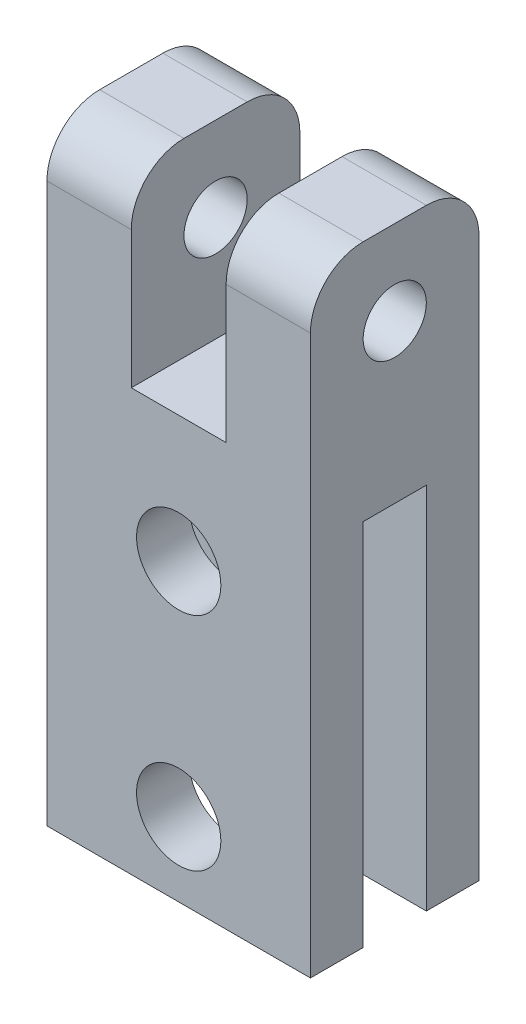
ISO-10303-21;
HEADER;
FILE_DESCRIPTION(('STEP AP214'),'2;1');
FILE_NAME('part.step','',(''),(''),'','','');
FILE_SCHEMA(('AUTOMOTIVE_DESIGN { 1 0 10303 214 1 1 1 1 }'));
ENDSEC;
DATA;
#1=APPLICATION_CONTEXT('core data for automotive mechanical design processes');
#2=APPLICATION_PROTOCOL_DEFINITION('international standard','automotive_design',2000,#1);
#3=PRODUCT_CONTEXT('',#1,'mechanical');
#4=PRODUCT('Part','Part','',(#3));
#5=PRODUCT_RELATED_PRODUCT_CATEGORY('part','',(#4));
#6=PRODUCT_DEFINITION_FORMATION('','',#4);
#7=PRODUCT_DEFINITION_CONTEXT('part definition',#1,'design');
#8=PRODUCT_DEFINITION('design','',#6,#7);
#9=PRODUCT_DEFINITION_SHAPE('','',#8);
#10=(LENGTH_UNIT() NAMED_UNIT(*) SI_UNIT(.MILLI.,.METRE.));
#11=(NAMED_UNIT(*) PLANE_ANGLE_UNIT() SI_UNIT($,.RADIAN.));
#12=(NAMED_UNIT(*) SI_UNIT($,.STERADIAN.) SOLID_ANGLE_UNIT());
#13=UNCERTAINTY_MEASURE_WITH_UNIT(LENGTH_MEASURE(1.E-05),#10,'distance_accuracy_value','');
#14=(GEOMETRIC_REPRESENTATION_CONTEXT(3) GLOBAL_UNCERTAINTY_ASSIGNED_CONTEXT((#13)) GLOBAL_UNIT_ASSIGNED_CONTEXT((#10,
#11,#12)) REPRESENTATION_CONTEXT('',''));
#15=CARTESIAN_POINT('',(0.,0.,0.));
#16=DIRECTION('',(0.,0.,1.));
#17=DIRECTION('',(1.,0.,0.));
#18=AXIS2_PLACEMENT_3D('',#15,#16,#17);
#19=CARTESIAN_POINT('',(0.,0.,16.));
#20=DIRECTION('',(0.,0.,1.));
#21=DIRECTION('',(1.,0.,0.));
#22=AXIS2_PLACEMENT_3D('',#19,#20,#21);
#23=PLANE('',#22);
#24=CARTESIAN_POINT('',(0.,21.,16.));
#25=DIRECTION('',(0.,0.,1.));
#26=DIRECTION('',(1.,0.,0.));
#27=AXIS2_PLACEMENT_3D('',#24,#25,#26);
#28=CIRCLE('',#27,4.00000000000001);
#29=CARTESIAN_POINT('',(4.00000000000001,21.,16.));
#30=VERTEX_POINT('',#29);
#31=EDGE_CURVE('E211',#30,#30,#28,.T.);
#32=ORIENTED_EDGE('',*,*,#31,.F.);
#33=EDGE_LOOP('',(#32));
#34=FACE_BOUND('',#33,.T.);
#35=CARTESIAN_POINT('',(0.,0.,16.));
#36=DIRECTION('',(0.,0.,1.));
#37=DIRECTION('',(1.,0.,0.));
#38=AXIS2_PLACEMENT_3D('',#35,#36,#37);
#39=CIRCLE('',#38,4.00000000000001);
#40=CARTESIAN_POINT('',(4.00000000000001,0.,16.));
#41=VERTEX_POINT('',#40);
#42=EDGE_CURVE('E203',#41,#41,#39,.T.);
#43=ORIENTED_EDGE('',*,*,#42,.F.);
#44=EDGE_LOOP('',(#43));
#45=FACE_BOUND('',#44,.T.);
#46=DIRECTION('',(0.,1.,0.));
#47=VECTOR('',#46,1.);
#48=CARTESIAN_POINT('',(-4.5,33.,16.));
#49=LINE('',#48,#47);
#50=CARTESIAN_POINT('',(-4.5,33.,16.));
#51=VERTEX_POINT('',#50);
#52=CARTESIAN_POINT('',(-4.5,46.,16.));
#53=VERTEX_POINT('',#52);
#54=EDGE_CURVE('E233',#51,#53,#49,.T.);
#55=ORIENTED_EDGE('',*,*,#54,.T.);
#56=DIRECTION('',(-1.,0.,0.));
#57=VECTOR('',#56,1.);
#58=CARTESIAN_POINT('',(0.,46.,16.));
#59=LINE('',#58,#57);
#60=CARTESIAN_POINT('',(-12.5,46.,16.));
#61=VERTEX_POINT('',#60);
#62=EDGE_CURVE('E11',#53,#61,#59,.T.);
#63=ORIENTED_EDGE('',*,*,#62,.T.);
#64=DIRECTION('',(0.,-1.,0.));
#65=VECTOR('',#64,1.);
#66=CARTESIAN_POINT('',(-12.5,28.,16.));
#67=LINE('',#66,#65);
#68=CARTESIAN_POINT('',(-12.5,-7.00000000000001,16.));
#69=VERTEX_POINT('',#68);
#70=EDGE_CURVE('E237',#61,#69,#67,.T.);
#71=ORIENTED_EDGE('',*,*,#70,.T.);
#72=DIRECTION('',(1.,0.,0.));
#73=VECTOR('',#72,1.);
#74=CARTESIAN_POINT('',(-12.5,-7.00000000000001,16.));
#75=LINE('',#74,#73);
#76=CARTESIAN_POINT('',(12.5,-7.00000000000001,16.));
#77=VERTEX_POINT('',#76);
#78=EDGE_CURVE('E219',#69,#77,#75,.T.);
#79=ORIENTED_EDGE('',*,*,#78,.T.);
#80=DIRECTION('',(0.,1.,0.));
#81=VECTOR('',#80,1.);
#82=CARTESIAN_POINT('',(12.5,-7.00000000000001,16.));
#83=LINE('',#82,#81);
#84=CARTESIAN_POINT('',(12.5,46.,16.));
#85=VERTEX_POINT('',#84);
#86=EDGE_CURVE('E223',#77,#85,#83,.T.);
#87=ORIENTED_EDGE('',*,*,#86,.T.);
#88=DIRECTION('',(-1.,0.,0.));
#89=VECTOR('',#88,1.);
#90=CARTESIAN_POINT('',(0.,46.,16.));
#91=LINE('',#90,#89);
#92=CARTESIAN_POINT('',(4.5,46.,16.));
#93=VERTEX_POINT('',#92);
#94=EDGE_CURVE('E48',#85,#93,#91,.T.);
#95=ORIENTED_EDGE('',*,*,#94,.T.);
#96=DIRECTION('',(0.,-1.,0.));
#97=VECTOR('',#96,1.);
#98=CARTESIAN_POINT('',(4.5,33.,16.));
#99=LINE('',#98,#97);
#100=CARTESIAN_POINT('',(4.5,33.,16.));
#101=VERTEX_POINT('',#100);
#102=EDGE_CURVE('E227',#93,#101,#99,.T.);
#103=ORIENTED_EDGE('',*,*,#102,.T.);
#104=DIRECTION('',(-1.,0.,0.));
#105=VECTOR('',#104,1.);
#106=CARTESIAN_POINT('',(-4.5,33.,16.));
#107=LINE('',#106,#105);
#108=EDGE_CURVE('E230',#101,#51,#107,.T.);
#109=ORIENTED_EDGE('',*,*,#108,.T.);
#110=EDGE_LOOP('',(#55,#63,#71,#79,#87,#95,#103,#109));
#111=FACE_BOUND('',#110,.T.);
#112=ADVANCED_FACE('F39',(#34,#45,#111),#23,.T.);
#113=CARTESIAN_POINT('',(0.,0.,0.));
#114=DIRECTION('',(0.,0.,1.));
#115=DIRECTION('',(1.,0.,0.));
#116=AXIS2_PLACEMENT_3D('',#113,#114,#115);
#117=PLANE('',#116);
#118=CARTESIAN_POINT('',(0.,21.,0.));
#119=DIRECTION('',(0.,0.,1.));
#120=DIRECTION('',(1.,0.,0.));
#121=AXIS2_PLACEMENT_3D('',#118,#119,#120);
#122=CIRCLE('',#121,4.00000000000001);
#123=CARTESIAN_POINT('',(4.00000000000001,21.,0.));
#124=VERTEX_POINT('',#123);
#125=EDGE_CURVE('E207',#124,#124,#122,.T.);
#126=ORIENTED_EDGE('',*,*,#125,.T.);
#127=EDGE_LOOP('',(#126));
#128=FACE_BOUND('',#127,.T.);
#129=CARTESIAN_POINT('',(0.,0.,0.));
#130=DIRECTION('',(0.,0.,1.));
#131=DIRECTION('',(1.,0.,0.));
#132=AXIS2_PLACEMENT_3D('',#129,#130,#131);
#133=CIRCLE('',#132,4.00000000000001);
#134=CARTESIAN_POINT('',(4.00000000000001,0.,0.));
#135=VERTEX_POINT('',#134);
#136=EDGE_CURVE('E202',#135,#135,#133,.T.);
#137=ORIENTED_EDGE('',*,*,#136,.T.);
#138=EDGE_LOOP('',(#137));
#139=FACE_BOUND('',#138,.T.);
#140=DIRECTION('',(0.,-1.,0.));
#141=VECTOR('',#140,1.);
#142=CARTESIAN_POINT('',(-12.5,28.,0.));
#143=LINE('',#142,#141);
#144=CARTESIAN_POINT('',(-12.5,46.,0.));
#145=VERTEX_POINT('',#144);
#146=CARTESIAN_POINT('',(-12.5,-7.00000000000001,0.));
#147=VERTEX_POINT('',#146);
#148=EDGE_CURVE('E224',#145,#147,#143,.T.);
#149=ORIENTED_EDGE('',*,*,#148,.F.);
#150=DIRECTION('',(-1.,0.,0.));
#151=VECTOR('',#150,1.);
#152=CARTESIAN_POINT('',(-4.5,46.,0.));
#153=LINE('',#152,#151);
#154=CARTESIAN_POINT('',(-4.5,46.,0.));
#155=VERTEX_POINT('',#154);
#156=EDGE_CURVE('E309',#145,#155,#153,.F.);
#157=ORIENTED_EDGE('',*,*,#156,.T.);
#158=DIRECTION('',(0.,1.,0.));
#159=VECTOR('',#158,1.);
#160=CARTESIAN_POINT('',(-4.5,33.,0.));
#161=LINE('',#160,#159);
#162=CARTESIAN_POINT('',(-4.5,33.,0.));
#163=VERTEX_POINT('',#162);
#164=EDGE_CURVE('E253',#163,#155,#161,.T.);
#165=ORIENTED_EDGE('',*,*,#164,.F.);
#166=DIRECTION('',(-1.,0.,0.));
#167=VECTOR('',#166,1.);
#168=CARTESIAN_POINT('',(-4.5,33.,0.));
#169=LINE('',#168,#167);
#170=CARTESIAN_POINT('',(4.5,33.,0.));
#171=VERTEX_POINT('',#170);
#172=EDGE_CURVE('E250',#171,#163,#169,.T.);
#173=ORIENTED_EDGE('',*,*,#172,.F.);
#174=DIRECTION('',(0.,-1.,0.));
#175=VECTOR('',#174,1.);
#176=CARTESIAN_POINT('',(4.5,33.,0.));
#177=LINE('',#176,#175);
#178=CARTESIAN_POINT('',(4.5,46.,0.));
#179=VERTEX_POINT('',#178);
#180=EDGE_CURVE('E247',#179,#171,#177,.T.);
#181=ORIENTED_EDGE('',*,*,#180,.F.);
#182=DIRECTION('',(-1.,0.,0.));
#183=VECTOR('',#182,1.);
#184=CARTESIAN_POINT('',(12.5,46.,0.));
#185=LINE('',#184,#183);
#186=CARTESIAN_POINT('',(12.5,46.,0.));
#187=VERTEX_POINT('',#186);
#188=EDGE_CURVE('E306',#179,#187,#185,.F.);
#189=ORIENTED_EDGE('',*,*,#188,.T.);
#190=DIRECTION('',(0.,1.,0.));
#191=VECTOR('',#190,1.);
#192=CARTESIAN_POINT('',(12.5,53.,0.));
#193=LINE('',#192,#191);
#194=CARTESIAN_POINT('',(12.5,-7.00000000000001,0.));
#195=VERTEX_POINT('',#194);
#196=EDGE_CURVE('E243',#195,#187,#193,.T.);
#197=ORIENTED_EDGE('',*,*,#196,.F.);
#198=DIRECTION('',(1.,0.,0.));
#199=VECTOR('',#198,1.);
#200=CARTESIAN_POINT('',(-12.5,-7.00000000000001,0.));
#201=LINE('',#200,#199);
#202=EDGE_CURVE('E215',#147,#195,#201,.T.);
#203=ORIENTED_EDGE('',*,*,#202,.F.);
#204=EDGE_LOOP('',(#149,#157,#165,#173,#181,#189,#197,#203));
#205=FACE_BOUND('',#204,.T.);
#206=ADVANCED_FACE('F370',(#128,#139,#205),#117,.F.);
#207=CARTESIAN_POINT('',(12.5,53.,16.));
#208=DIRECTION('',(-1.,0.,0.));
#209=DIRECTION('',(0.,0.,1.));
#210=AXIS2_PLACEMENT_3D('',#207,#208,#209);
#211=PLANE('',#210);
#212=CARTESIAN_POINT('',(12.5,43.,8.));
#213=DIRECTION('',(-1.,0.,0.));
#214=DIRECTION('',(0.,0.,1.));
#215=AXIS2_PLACEMENT_3D('',#212,#213,#214);
#216=CIRCLE('',#215,3.);
#217=CARTESIAN_POINT('',(12.5,43.,11.));
#218=VERTEX_POINT('',#217);
#219=EDGE_CURVE('E388',#218,#218,#216,.F.);
#220=ORIENTED_EDGE('',*,*,#219,.F.);
#221=EDGE_LOOP('',(#220));
#222=FACE_BOUND('',#221,.T.);
#223=ORIENTED_EDGE('',*,*,#196,.T.);
#224=CARTESIAN_POINT('',(12.5,46.,5.));
#225=DIRECTION('',(-1.,0.,0.));
#226=DIRECTION('',(0.,0.,1.));
#227=AXIS2_PLACEMENT_3D('',#224,#225,#226);
#228=CIRCLE('',#227,5.);
#229=CARTESIAN_POINT('',(12.5,51.,5.));
#230=VERTEX_POINT('',#229);
#231=EDGE_CURVE('E332',#187,#230,#228,.F.);
#232=ORIENTED_EDGE('',*,*,#231,.T.);
#233=DIRECTION('',(0.,0.,-1.));
#234=VECTOR('',#233,1.);
#235=CARTESIAN_POINT('',(12.5,51.,16.));
#236=LINE('',#235,#234);
#237=CARTESIAN_POINT('',(12.5,51.,11.));
#238=VERTEX_POINT('',#237);
#239=EDGE_CURVE('E289',#238,#230,#236,.T.);
#240=ORIENTED_EDGE('',*,*,#239,.F.);
#241=CARTESIAN_POINT('',(12.5,46.,11.));
#242=DIRECTION('',(-1.,0.,0.));
#243=DIRECTION('',(0.,0.,1.));
#244=AXIS2_PLACEMENT_3D('',#241,#242,#243);
#245=CIRCLE('',#244,5.);
#246=EDGE_CURVE('E55',#238,#85,#245,.F.);
#247=ORIENTED_EDGE('',*,*,#246,.T.);
#248=ORIENTED_EDGE('',*,*,#86,.F.);
#249=DIRECTION('',(0.,0.,-1.));
#250=VECTOR('',#249,1.);
#251=CARTESIAN_POINT('',(12.5,-7.00000000000001,16.));
#252=LINE('',#251,#250);
#253=CARTESIAN_POINT('',(12.5,-7.00000000000001,11.));
#254=VERTEX_POINT('',#253);
#255=EDGE_CURVE('E272',#77,#254,#252,.T.);
#256=ORIENTED_EDGE('',*,*,#255,.T.);
#257=DIRECTION('',(0.,-1.,0.));
#258=VECTOR('',#257,1.);
#259=CARTESIAN_POINT('',(12.5,28.,11.));
#260=LINE('',#259,#258);
#261=CARTESIAN_POINT('',(12.5,28.,11.));
#262=VERTEX_POINT('',#261);
#263=EDGE_CURVE('E187',#262,#254,#260,.T.);
#264=ORIENTED_EDGE('',*,*,#263,.F.);
#265=DIRECTION('',(0.,0.,1.));
#266=VECTOR('',#265,1.);
#267=CARTESIAN_POINT('',(12.5,28.,11.));
#268=LINE('',#267,#266);
#269=CARTESIAN_POINT('',(12.5,28.,5.));
#270=VERTEX_POINT('',#269);
#271=EDGE_CURVE('E165',#270,#262,#268,.T.);
#272=ORIENTED_EDGE('',*,*,#271,.F.);
#273=DIRECTION('',(0.,-1.,0.));
#274=VECTOR('',#273,1.);
#275=CARTESIAN_POINT('',(12.5,28.,5.));
#276=LINE('',#275,#274);
#277=CARTESIAN_POINT('',(12.5,-7.00000000000001,5.));
#278=VERTEX_POINT('',#277);
#279=EDGE_CURVE('E161',#270,#278,#276,.T.);
#280=ORIENTED_EDGE('',*,*,#279,.T.);
#281=EDGE_CURVE('E271',#278,#195,#252,.T.);
#282=ORIENTED_EDGE('',*,*,#281,.T.);
#283=EDGE_LOOP('',(#223,#232,#240,#247,#248,#256,#264,#272,#280,#282));
#284=FACE_BOUND('',#283,.T.);
#285=ADVANCED_FACE('F423',(#222,#284),#211,.F.);
#286=CARTESIAN_POINT('',(4.5,33.,16.));
#287=DIRECTION('',(1.,0.,0.));
#288=DIRECTION('',(0.,0.,-1.));
#289=AXIS2_PLACEMENT_3D('',#286,#287,#288);
#290=PLANE('',#289);
#291=CARTESIAN_POINT('',(4.5,43.,8.));
#292=DIRECTION('',(1.,0.,0.));
#293=DIRECTION('',(0.,0.,-1.));
#294=AXIS2_PLACEMENT_3D('',#291,#292,#293);
#295=CIRCLE('',#294,3.);
#296=CARTESIAN_POINT('',(4.5,43.,5.));
#297=VERTEX_POINT('',#296);
#298=EDGE_CURVE('E395',#297,#297,#295,.F.);
#299=ORIENTED_EDGE('',*,*,#298,.F.);
#300=EDGE_LOOP('',(#299));
#301=FACE_BOUND('',#300,.T.);
#302=DIRECTION('',(0.,0.,1.));
#303=VECTOR('',#302,1.);
#304=CARTESIAN_POINT('',(4.5,51.,16.));
#305=LINE('',#304,#303);
#306=CARTESIAN_POINT('',(4.5,51.,5.));
#307=VERTEX_POINT('',#306);
#308=CARTESIAN_POINT('',(4.5,51.,11.));
#309=VERTEX_POINT('',#308);
#310=EDGE_CURVE('E405',#307,#309,#305,.T.);
#311=ORIENTED_EDGE('',*,*,#310,.F.);
#312=CARTESIAN_POINT('',(4.5,46.,5.));
#313=DIRECTION('',(1.,0.,0.));
#314=DIRECTION('',(0.,0.,-1.));
#315=AXIS2_PLACEMENT_3D('',#312,#313,#314);
#316=CIRCLE('',#315,5.);
#317=EDGE_CURVE('E327',#307,#179,#316,.F.);
#318=ORIENTED_EDGE('',*,*,#317,.T.);
#319=ORIENTED_EDGE('',*,*,#180,.T.);
#320=DIRECTION('',(0.,0.,-1.));
#321=VECTOR('',#320,1.);
#322=CARTESIAN_POINT('',(4.5,33.,16.));
#323=LINE('',#322,#321);
#324=EDGE_CURVE('E267',#101,#171,#323,.T.);
#325=ORIENTED_EDGE('',*,*,#324,.F.);
#326=ORIENTED_EDGE('',*,*,#102,.F.);
#327=CARTESIAN_POINT('',(4.5,46.,11.));
#328=DIRECTION('',(1.,0.,0.));
#329=DIRECTION('',(0.,0.,-1.));
#330=AXIS2_PLACEMENT_3D('',#327,#328,#329);
#331=CIRCLE('',#330,5.);
#332=EDGE_CURVE('E63',#93,#309,#331,.F.);
#333=ORIENTED_EDGE('',*,*,#332,.T.);
#334=EDGE_LOOP('',(#311,#318,#319,#325,#326,#333));
#335=FACE_BOUND('',#334,.T.);
#336=ADVANCED_FACE('F340',(#301,#335),#290,.F.);
#337=CARTESIAN_POINT('',(-4.5,33.,16.));
#338=DIRECTION('',(-1.,0.,0.));
#339=DIRECTION('',(0.,0.,1.));
#340=AXIS2_PLACEMENT_3D('',#337,#338,#339);
#341=PLANE('',#340);
#342=CARTESIAN_POINT('',(-4.5,43.,8.));
#343=DIRECTION('',(-1.,0.,0.));
#344=DIRECTION('',(0.,0.,1.));
#345=AXIS2_PLACEMENT_3D('',#342,#343,#344);
#346=CIRCLE('',#345,3.);
#347=CARTESIAN_POINT('',(-4.5,43.,11.));
#348=VERTEX_POINT('',#347);
#349=EDGE_CURVE('E288',#348,#348,#346,.F.);
#350=ORIENTED_EDGE('',*,*,#349,.F.);
#351=EDGE_LOOP('',(#350));
#352=FACE_BOUND('',#351,.T.);
#353=ORIENTED_EDGE('',*,*,#164,.T.);
#354=CARTESIAN_POINT('',(-4.5,46.,5.));
#355=DIRECTION('',(-1.,0.,0.));
#356=DIRECTION('',(0.,0.,1.));
#357=AXIS2_PLACEMENT_3D('',#354,#355,#356);
#358=CIRCLE('',#357,5.);
#359=CARTESIAN_POINT('',(-4.5,51.,5.));
#360=VERTEX_POINT('',#359);
#361=EDGE_CURVE('E315',#155,#360,#358,.F.);
#362=ORIENTED_EDGE('',*,*,#361,.T.);
#363=DIRECTION('',(0.,0.,-1.));
#364=VECTOR('',#363,1.);
#365=CARTESIAN_POINT('',(-4.5,51.,16.));
#366=LINE('',#365,#364);
#367=CARTESIAN_POINT('',(-4.5,51.,11.));
#368=VERTEX_POINT('',#367);
#369=EDGE_CURVE('E362',#368,#360,#366,.T.);
#370=ORIENTED_EDGE('',*,*,#369,.F.);
#371=CARTESIAN_POINT('',(-4.5,46.,11.));
#372=DIRECTION('',(-1.,0.,0.));
#373=DIRECTION('',(0.,0.,1.));
#374=AXIS2_PLACEMENT_3D('',#371,#372,#373);
#375=CIRCLE('',#374,5.);
#376=EDGE_CURVE('E312',#368,#53,#375,.F.);
#377=ORIENTED_EDGE('',*,*,#376,.T.);
#378=ORIENTED_EDGE('',*,*,#54,.F.);
#379=DIRECTION('',(0.,0.,-1.));
#380=VECTOR('',#379,1.);
#381=CARTESIAN_POINT('',(-4.5,33.,16.));
#382=LINE('',#381,#380);
#383=EDGE_CURVE('E263',#51,#163,#382,.T.);
#384=ORIENTED_EDGE('',*,*,#383,.T.);
#385=EDGE_LOOP('',(#353,#362,#370,#377,#378,#384));
#386=FACE_BOUND('',#385,.T.);
#387=ADVANCED_FACE('F435',(#352,#386),#341,.F.);
#388=CARTESIAN_POINT('',(-12.5,28.,16.));
#389=DIRECTION('',(1.,0.,0.));
#390=DIRECTION('',(0.,0.,-1.));
#391=AXIS2_PLACEMENT_3D('',#388,#389,#390);
#392=PLANE('',#391);
#393=CARTESIAN_POINT('',(-12.5,43.,8.));
#394=DIRECTION('',(1.,0.,0.));
#395=DIRECTION('',(0.,0.,-1.));
#396=AXIS2_PLACEMENT_3D('',#393,#394,#395);
#397=CIRCLE('',#396,3.);
#398=CARTESIAN_POINT('',(-12.5,43.,5.));
#399=VERTEX_POINT('',#398);
#400=EDGE_CURVE('E284',#399,#399,#397,.F.);
#401=ORIENTED_EDGE('',*,*,#400,.F.);
#402=EDGE_LOOP('',(#401));
#403=FACE_BOUND('',#402,.T.);
#404=DIRECTION('',(0.,0.,1.));
#405=VECTOR('',#404,1.);
#406=CARTESIAN_POINT('',(-12.5,51.,16.));
#407=LINE('',#406,#405);
#408=CARTESIAN_POINT('',(-12.5,51.,5.));
#409=VERTEX_POINT('',#408);
#410=CARTESIAN_POINT('',(-12.5,51.,11.));
#411=VERTEX_POINT('',#410);
#412=EDGE_CURVE('E276',#409,#411,#407,.T.);
#413=ORIENTED_EDGE('',*,*,#412,.F.);
#414=CARTESIAN_POINT('',(-12.5,46.,5.));
#415=DIRECTION('',(1.,0.,0.));
#416=DIRECTION('',(0.,0.,-1.));
#417=AXIS2_PLACEMENT_3D('',#414,#415,#416);
#418=CIRCLE('',#417,5.);
#419=EDGE_CURVE('E303',#409,#145,#418,.F.);
#420=ORIENTED_EDGE('',*,*,#419,.T.);
#421=ORIENTED_EDGE('',*,*,#148,.T.);
#422=DIRECTION('',(0.,0.,-1.));
#423=VECTOR('',#422,1.);
#424=CARTESIAN_POINT('',(-12.5,-7.00000000000001,16.));
#425=LINE('',#424,#423);
#426=CARTESIAN_POINT('',(-12.5,-7.00000000000001,5.));
#427=VERTEX_POINT('',#426);
#428=EDGE_CURVE('E182',#427,#147,#425,.T.);
#429=ORIENTED_EDGE('',*,*,#428,.F.);
#430=DIRECTION('',(0.,-1.,0.));
#431=VECTOR('',#430,1.);
#432=CARTESIAN_POINT('',(-12.5,28.,5.));
#433=LINE('',#432,#431);
#434=CARTESIAN_POINT('',(-12.5,28.,5.));
#435=VERTEX_POINT('',#434);
#436=EDGE_CURVE('E158',#435,#427,#433,.T.);
#437=ORIENTED_EDGE('',*,*,#436,.F.);
#438=DIRECTION('',(0.,0.,-1.));
#439=VECTOR('',#438,1.);
#440=CARTESIAN_POINT('',(-12.5,28.,11.));
#441=LINE('',#440,#439);
#442=CARTESIAN_POINT('',(-12.5,28.,11.));
#443=VERTEX_POINT('',#442);
#444=EDGE_CURVE('E166',#443,#435,#441,.T.);
#445=ORIENTED_EDGE('',*,*,#444,.F.);
#446=DIRECTION('',(0.,-1.,0.));
#447=VECTOR('',#446,1.);
#448=CARTESIAN_POINT('',(-12.5,28.,11.));
#449=LINE('',#448,#447);
#450=CARTESIAN_POINT('',(-12.5,-7.00000000000001,11.));
#451=VERTEX_POINT('',#450);
#452=EDGE_CURVE('E280',#443,#451,#449,.T.);
#453=ORIENTED_EDGE('',*,*,#452,.T.);
#454=EDGE_CURVE('E259',#69,#451,#425,.T.);
#455=ORIENTED_EDGE('',*,*,#454,.F.);
#456=ORIENTED_EDGE('',*,*,#70,.F.);
#457=CARTESIAN_POINT('',(-12.5,46.,11.));
#458=DIRECTION('',(1.,0.,0.));
#459=DIRECTION('',(0.,0.,-1.));
#460=AXIS2_PLACEMENT_3D('',#457,#458,#459);
#461=CIRCLE('',#460,5.);
#462=EDGE_CURVE('E300',#61,#411,#461,.F.);
#463=ORIENTED_EDGE('',*,*,#462,.T.);
#464=EDGE_LOOP('',(#413,#420,#421,#429,#437,#445,#453,#455,#456,#463));
#465=FACE_BOUND('',#464,.T.);
#466=ADVANCED_FACE('F180',(#403,#465),#392,.F.);
#467=CARTESIAN_POINT('',(-12.5,-7.00000000000001,16.));
#468=DIRECTION('',(0.,1.,0.));
#469=DIRECTION('',(0.,0.,1.));
#470=AXIS2_PLACEMENT_3D('',#467,#468,#469);
#471=PLANE('',#470);
#472=ORIENTED_EDGE('',*,*,#454,.T.);
#473=DIRECTION('',(-1.,0.,0.));
#474=VECTOR('',#473,1.);
#475=CARTESIAN_POINT('',(-12.5,-7.00000000000001,11.));
#476=LINE('',#475,#474);
#477=EDGE_CURVE('E176',#254,#451,#476,.T.);
#478=ORIENTED_EDGE('',*,*,#477,.F.);
#479=ORIENTED_EDGE('',*,*,#255,.F.);
#480=ORIENTED_EDGE('',*,*,#78,.F.);
#481=EDGE_LOOP('',(#472,#478,#479,#480));
#482=FACE_BOUND('',#481,.T.);
#483=ADVANCED_FACE('F434',(#482),#471,.F.);
#484=CARTESIAN_POINT('',(0.,21.,16.));
#485=DIRECTION('',(0.,0.,-1.));
#486=DIRECTION('',(-1.,0.,0.));
#487=AXIS2_PLACEMENT_3D('',#484,#485,#486);
#488=CYLINDRICAL_SURFACE('',#487,4.00000000000001);
#489=CARTESIAN_POINT('',(0.,21.,11.));
#490=DIRECTION('',(0.,0.,1.));
#491=DIRECTION('',(1.,0.,0.));
#492=AXIS2_PLACEMENT_3D('',#489,#490,#491);
#493=CIRCLE('',#492,4.00000000000001);
#494=CARTESIAN_POINT('',(4.00000000000001,21.,11.));
#495=VERTEX_POINT('',#494);
#496=EDGE_CURVE('E198',#495,#495,#493,.T.);
#497=ORIENTED_EDGE('',*,*,#496,.F.);
#498=EDGE_LOOP('',(#497));
#499=FACE_BOUND('',#498,.T.);
#500=ORIENTED_EDGE('',*,*,#31,.T.);
#501=EDGE_LOOP('',(#500));
#502=FACE_BOUND('',#501,.T.);
#503=ADVANCED_FACE('F465',(#499,#502),#488,.F.);
#504=CARTESIAN_POINT('',(0.,0.,16.));
#505=DIRECTION('',(0.,0.,-1.));
#506=DIRECTION('',(-1.,0.,0.));
#507=AXIS2_PLACEMENT_3D('',#504,#505,#506);
#508=CYLINDRICAL_SURFACE('',#507,4.00000000000001);
#509=CARTESIAN_POINT('',(0.,0.,11.));
#510=DIRECTION('',(0.,0.,1.));
#511=DIRECTION('',(1.,0.,0.));
#512=AXIS2_PLACEMENT_3D('',#509,#510,#511);
#513=CIRCLE('',#512,4.00000000000001);
#514=CARTESIAN_POINT('',(4.00000000000001,0.,11.));
#515=VERTEX_POINT('',#514);
#516=EDGE_CURVE('E196',#515,#515,#513,.T.);
#517=ORIENTED_EDGE('',*,*,#516,.F.);
#518=EDGE_LOOP('',(#517));
#519=FACE_BOUND('',#518,.T.);
#520=ORIENTED_EDGE('',*,*,#42,.T.);
#521=EDGE_LOOP('',(#520));
#522=FACE_BOUND('',#521,.T.);
#523=ADVANCED_FACE('F450',(#519,#522),#508,.F.);
#524=ORIENTED_EDGE('',*,*,#281,.F.);
#525=DIRECTION('',(1.,0.,0.));
#526=VECTOR('',#525,1.);
#527=CARTESIAN_POINT('',(-12.5,-7.00000000000001,5.));
#528=LINE('',#527,#526);
#529=EDGE_CURVE('E376',#427,#278,#528,.T.);
#530=ORIENTED_EDGE('',*,*,#529,.F.);
#531=ORIENTED_EDGE('',*,*,#428,.T.);
#532=ORIENTED_EDGE('',*,*,#202,.T.);
#533=EDGE_LOOP('',(#524,#530,#531,#532));
#534=FACE_BOUND('',#533,.T.);
#535=ADVANCED_FACE('F375',(#534),#471,.F.);
#536=CARTESIAN_POINT('',(-4.5,33.,16.));
#537=DIRECTION('',(0.,-1.,0.));
#538=DIRECTION('',(0.,0.,-1.));
#539=AXIS2_PLACEMENT_3D('',#536,#537,#538);
#540=PLANE('',#539);
#541=ORIENTED_EDGE('',*,*,#172,.T.);
#542=ORIENTED_EDGE('',*,*,#383,.F.);
#543=ORIENTED_EDGE('',*,*,#108,.F.);
#544=ORIENTED_EDGE('',*,*,#324,.T.);
#545=EDGE_LOOP('',(#541,#542,#543,#544));
#546=FACE_BOUND('',#545,.T.);
#547=ADVANCED_FACE('F347',(#546),#540,.F.);
#548=CARTESIAN_POINT('',(0.,21.,5.));
#549=DIRECTION('',(0.,0.,-1.));
#550=DIRECTION('',(-1.,0.,0.));
#551=AXIS2_PLACEMENT_3D('',#548,#549,#550);
#552=CIRCLE('',#551,4.00000000000001);
#553=CARTESIAN_POINT('',(-4.00000000000001,21.,5.));
#554=VERTEX_POINT('',#553);
#555=EDGE_CURVE('E192',#554,#554,#552,.T.);
#556=ORIENTED_EDGE('',*,*,#555,.F.);
#557=EDGE_LOOP('',(#556));
#558=FACE_BOUND('',#557,.T.);
#559=ORIENTED_EDGE('',*,*,#125,.F.);
#560=EDGE_LOOP('',(#559));
#561=FACE_BOUND('',#560,.T.);
#562=ADVANCED_FACE('F429',(#558,#561),#488,.F.);
#563=CARTESIAN_POINT('',(0.,0.,5.));
#564=DIRECTION('',(0.,0.,-1.));
#565=DIRECTION('',(-1.,0.,0.));
#566=AXIS2_PLACEMENT_3D('',#563,#564,#565);
#567=CIRCLE('',#566,4.00000000000001);
#568=CARTESIAN_POINT('',(-4.00000000000001,0.,5.));
#569=VERTEX_POINT('',#568);
#570=EDGE_CURVE('E197',#569,#569,#567,.T.);
#571=ORIENTED_EDGE('',*,*,#570,.F.);
#572=EDGE_LOOP('',(#571));
#573=FACE_BOUND('',#572,.T.);
#574=ORIENTED_EDGE('',*,*,#136,.F.);
#575=EDGE_LOOP('',(#574));
#576=FACE_BOUND('',#575,.T.);
#577=ADVANCED_FACE('F474',(#573,#576),#508,.F.);
#578=CARTESIAN_POINT('',(-12.5,28.,11.));
#579=DIRECTION('',(0.,0.,1.));
#580=DIRECTION('',(1.,0.,0.));
#581=AXIS2_PLACEMENT_3D('',#578,#579,#580);
#582=PLANE('',#581);
#583=ORIENTED_EDGE('',*,*,#496,.T.);
#584=EDGE_LOOP('',(#583));
#585=FACE_BOUND('',#584,.T.);
#586=ORIENTED_EDGE('',*,*,#516,.T.);
#587=EDGE_LOOP('',(#586));
#588=FACE_BOUND('',#587,.T.);
#589=ORIENTED_EDGE('',*,*,#477,.T.);
#590=ORIENTED_EDGE('',*,*,#452,.F.);
#591=DIRECTION('',(-1.,0.,0.));
#592=VECTOR('',#591,1.);
#593=CARTESIAN_POINT('',(-12.5,28.,11.));
#594=LINE('',#593,#592);
#595=EDGE_CURVE('E171',#262,#443,#594,.T.);
#596=ORIENTED_EDGE('',*,*,#595,.F.);
#597=ORIENTED_EDGE('',*,*,#263,.T.);
#598=EDGE_LOOP('',(#589,#590,#596,#597));
#599=FACE_BOUND('',#598,.T.);
#600=ADVANCED_FACE('F460',(#585,#588,#599),#582,.F.);
#601=CARTESIAN_POINT('',(-12.5,28.,5.));
#602=DIRECTION('',(0.,0.,-1.));
#603=DIRECTION('',(-1.,0.,0.));
#604=AXIS2_PLACEMENT_3D('',#601,#602,#603);
#605=PLANE('',#604);
#606=ORIENTED_EDGE('',*,*,#555,.T.);
#607=EDGE_LOOP('',(#606));
#608=FACE_BOUND('',#607,.T.);
#609=ORIENTED_EDGE('',*,*,#570,.T.);
#610=EDGE_LOOP('',(#609));
#611=FACE_BOUND('',#610,.T.);
#612=ORIENTED_EDGE('',*,*,#529,.T.);
#613=ORIENTED_EDGE('',*,*,#279,.F.);
#614=DIRECTION('',(1.,0.,0.));
#615=VECTOR('',#614,1.);
#616=CARTESIAN_POINT('',(-12.5,28.,5.));
#617=LINE('',#616,#615);
#618=EDGE_CURVE('E154',#435,#270,#617,.T.);
#619=ORIENTED_EDGE('',*,*,#618,.F.);
#620=ORIENTED_EDGE('',*,*,#436,.T.);
#621=EDGE_LOOP('',(#612,#613,#619,#620));
#622=FACE_BOUND('',#621,.T.);
#623=ADVANCED_FACE('F156',(#608,#611,#622),#605,.F.);
#624=CARTESIAN_POINT('',(0.,28.,0.));
#625=DIRECTION('',(0.,-1.,0.));
#626=DIRECTION('',(0.,0.,-1.));
#627=AXIS2_PLACEMENT_3D('',#624,#625,#626);
#628=PLANE('',#627);
#629=ORIENTED_EDGE('',*,*,#444,.T.);
#630=ORIENTED_EDGE('',*,*,#618,.T.);
#631=ORIENTED_EDGE('',*,*,#271,.T.);
#632=ORIENTED_EDGE('',*,*,#595,.T.);
#633=EDGE_LOOP('',(#629,#630,#631,#632));
#634=FACE_BOUND('',#633,.T.);
#635=ADVANCED_FACE('F169',(#634),#628,.T.);
#636=CARTESIAN_POINT('',(-31.5,43.,8.));
#637=DIRECTION('',(1.,0.,0.));
#638=DIRECTION('',(0.,0.,-1.));
#639=AXIS2_PLACEMENT_3D('',#636,#637,#638);
#640=CYLINDRICAL_SURFACE('',#639,3.);
#641=ORIENTED_EDGE('',*,*,#400,.T.);
#642=EDGE_LOOP('',(#641));
#643=FACE_BOUND('',#642,.T.);
#644=ORIENTED_EDGE('',*,*,#349,.T.);
#645=EDGE_LOOP('',(#644));
#646=FACE_BOUND('',#645,.T.);
#647=ADVANCED_FACE('F498',(#643,#646),#640,.F.);
#648=ORIENTED_EDGE('',*,*,#298,.T.);
#649=EDGE_LOOP('',(#648));
#650=FACE_BOUND('',#649,.T.);
#651=ORIENTED_EDGE('',*,*,#219,.T.);
#652=EDGE_LOOP('',(#651));
#653=FACE_BOUND('',#652,.T.);
#654=ADVANCED_FACE('F503',(#650,#653),#640,.F.);
#655=CARTESIAN_POINT('',(0.,51.,0.));
#656=DIRECTION('',(0.,1.,0.));
#657=DIRECTION('',(0.,0.,1.));
#658=AXIS2_PLACEMENT_3D('',#655,#656,#657);
#659=PLANE('',#658);
#660=ORIENTED_EDGE('',*,*,#369,.T.);
#661=DIRECTION('',(-1.,0.,0.));
#662=VECTOR('',#661,1.);
#663=CARTESIAN_POINT('',(-12.5,51.,5.));
#664=LINE('',#663,#662);
#665=EDGE_CURVE('E296',#360,#409,#664,.T.);
#666=ORIENTED_EDGE('',*,*,#665,.T.);
#667=ORIENTED_EDGE('',*,*,#412,.T.);
#668=DIRECTION('',(-1.,0.,0.));
#669=VECTOR('',#668,1.);
#670=CARTESIAN_POINT('',(0.,51.,11.));
#671=LINE('',#670,#669);
#672=EDGE_CURVE('E293',#411,#368,#671,.F.);
#673=ORIENTED_EDGE('',*,*,#672,.T.);
#674=EDGE_LOOP('',(#660,#666,#667,#673));
#675=FACE_BOUND('',#674,.T.);
#676=ADVANCED_FACE('F359',(#675),#659,.T.);
#677=ORIENTED_EDGE('',*,*,#239,.T.);
#678=DIRECTION('',(-1.,0.,0.));
#679=VECTOR('',#678,1.);
#680=CARTESIAN_POINT('',(4.5,51.,5.));
#681=LINE('',#680,#679);
#682=EDGE_CURVE('E321',#230,#307,#681,.T.);
#683=ORIENTED_EDGE('',*,*,#682,.T.);
#684=ORIENTED_EDGE('',*,*,#310,.T.);
#685=DIRECTION('',(-1.,0.,0.));
#686=VECTOR('',#685,1.);
#687=CARTESIAN_POINT('',(0.,51.,11.));
#688=LINE('',#687,#686);
#689=EDGE_CURVE('E318',#309,#238,#688,.F.);
#690=ORIENTED_EDGE('',*,*,#689,.T.);
#691=EDGE_LOOP('',(#677,#683,#684,#690));
#692=FACE_BOUND('',#691,.T.);
#693=ADVANCED_FACE('F410',(#692),#659,.T.);
#694=CARTESIAN_POINT('',(0.,46.,5.));
#695=DIRECTION('',(1.,0.,0.));
#696=DIRECTION('',(0.,0.,-1.));
#697=AXIS2_PLACEMENT_3D('',#694,#695,#696);
#698=CYLINDRICAL_SURFACE('',#697,5.);
#699=ORIENTED_EDGE('',*,*,#361,.F.);
#700=ORIENTED_EDGE('',*,*,#156,.F.);
#701=ORIENTED_EDGE('',*,*,#419,.F.);
#702=ORIENTED_EDGE('',*,*,#665,.F.);
#703=EDGE_LOOP('',(#699,#700,#701,#702));
#704=FACE_BOUND('',#703,.T.);
#705=ADVANCED_FACE('F365',(#704),#698,.T.);
#706=CARTESIAN_POINT('',(0.,46.,5.));
#707=DIRECTION('',(1.,0.,0.));
#708=DIRECTION('',(0.,0.,-1.));
#709=AXIS2_PLACEMENT_3D('',#706,#707,#708);
#710=CYLINDRICAL_SURFACE('',#709,5.);
#711=ORIENTED_EDGE('',*,*,#231,.F.);
#712=ORIENTED_EDGE('',*,*,#188,.F.);
#713=ORIENTED_EDGE('',*,*,#317,.F.);
#714=ORIENTED_EDGE('',*,*,#682,.F.);
#715=EDGE_LOOP('',(#711,#712,#713,#714));
#716=FACE_BOUND('',#715,.T.);
#717=ADVANCED_FACE('F416',(#716),#710,.T.);
#718=CARTESIAN_POINT('',(0.,46.,11.));
#719=DIRECTION('',(-1.,0.,0.));
#720=DIRECTION('',(0.,0.,1.));
#721=AXIS2_PLACEMENT_3D('',#718,#719,#720);
#722=CYLINDRICAL_SURFACE('',#721,5.);
#723=ORIENTED_EDGE('',*,*,#376,.F.);
#724=ORIENTED_EDGE('',*,*,#672,.F.);
#725=ORIENTED_EDGE('',*,*,#462,.F.);
#726=ORIENTED_EDGE('',*,*,#62,.F.);
#727=EDGE_LOOP('',(#723,#724,#725,#726));
#728=FACE_BOUND('',#727,.T.);
#729=ADVANCED_FACE('F354',(#728),#722,.T.);
#730=CARTESIAN_POINT('',(0.,46.,11.));
#731=DIRECTION('',(-1.,0.,0.));
#732=DIRECTION('',(0.,0.,1.));
#733=AXIS2_PLACEMENT_3D('',#730,#731,#732);
#734=CYLINDRICAL_SURFACE('',#733,5.);
#735=ORIENTED_EDGE('',*,*,#246,.F.);
#736=ORIENTED_EDGE('',*,*,#689,.F.);
#737=ORIENTED_EDGE('',*,*,#332,.F.);
#738=ORIENTED_EDGE('',*,*,#94,.F.);
#739=EDGE_LOOP('',(#735,#736,#737,#738));
#740=FACE_BOUND('',#739,.T.);
#741=ADVANCED_FACE('F41',(#740),#734,.T.);
#742=CLOSED_SHELL('',(#112,#206,#285,#336,#387,#466,#483,#503,#523,#535,#547,#562,#577,#600,
#623,#635,#647,#654,#676,#693,#705,#717,#729,#741));
#743=MANIFOLD_SOLID_BREP('B2',#742);
#744=ADVANCED_BREP_SHAPE_REPRESENTATION('',(#18,#743),#14);
#745=SHAPE_DEFINITION_REPRESENTATION(#9,#744);
ENDSEC;
END-ISO-10303-21;
